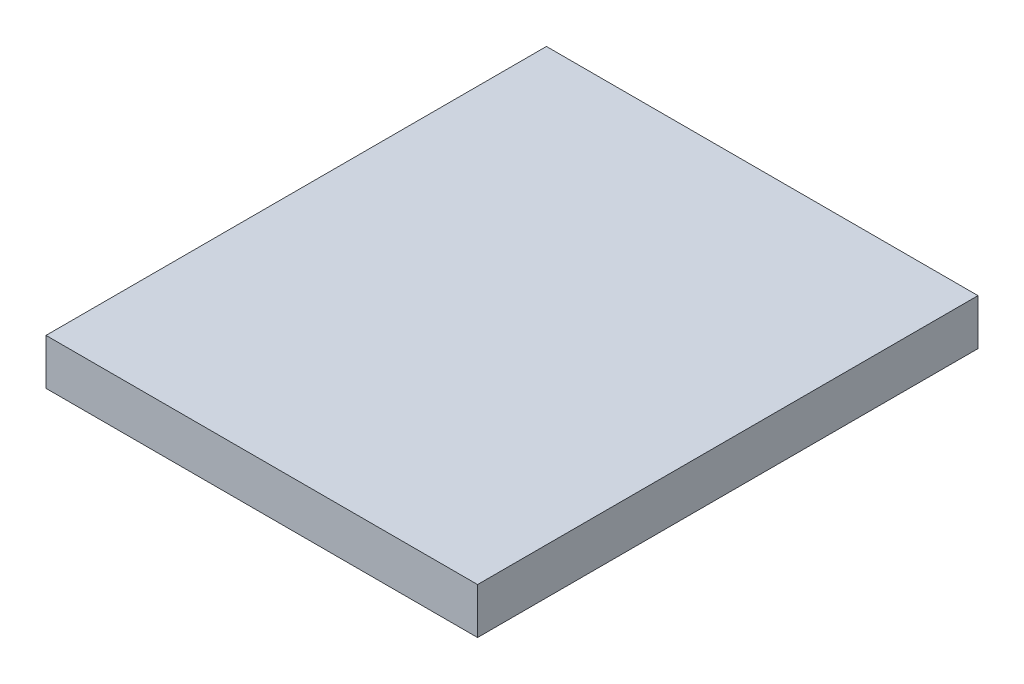
ISO-10303-21;
HEADER;
FILE_DESCRIPTION(('STEP AP214'),'2;1');
FILE_NAME('part.step','',(''),(''),'','','');
FILE_SCHEMA(('AUTOMOTIVE_DESIGN { 1 0 10303 214 1 1 1 1 }'));
ENDSEC;
DATA;
#1=APPLICATION_CONTEXT('core data for automotive mechanical design processes');
#2=APPLICATION_PROTOCOL_DEFINITION('international standard','automotive_design',2000,#1);
#3=PRODUCT_CONTEXT('',#1,'mechanical');
#4=PRODUCT('Part','Part','',(#3));
#5=PRODUCT_RELATED_PRODUCT_CATEGORY('part','',(#4));
#6=PRODUCT_DEFINITION_FORMATION('','',#4);
#7=PRODUCT_DEFINITION_CONTEXT('part definition',#1,'design');
#8=PRODUCT_DEFINITION('design','',#6,#7);
#9=PRODUCT_DEFINITION_SHAPE('','',#8);
#10=(LENGTH_UNIT() NAMED_UNIT(*) SI_UNIT(.MILLI.,.METRE.));
#11=(NAMED_UNIT(*) PLANE_ANGLE_UNIT() SI_UNIT($,.RADIAN.));
#12=(NAMED_UNIT(*) SI_UNIT($,.STERADIAN.) SOLID_ANGLE_UNIT());
#13=UNCERTAINTY_MEASURE_WITH_UNIT(LENGTH_MEASURE(1.E-05),#10,'distance_accuracy_value','');
#14=(GEOMETRIC_REPRESENTATION_CONTEXT(3) GLOBAL_UNCERTAINTY_ASSIGNED_CONTEXT((#13)) GLOBAL_UNIT_ASSIGNED_CONTEXT((#10,
#11,#12)) REPRESENTATION_CONTEXT('',''));
#15=CARTESIAN_POINT('',(0.,0.,0.));
#16=DIRECTION('',(0.,0.,1.));
#17=DIRECTION('',(1.,0.,0.));
#18=AXIS2_PLACEMENT_3D('',#15,#16,#17);
#19=CARTESIAN_POINT('',(0.,0.,0.));
#20=DIRECTION('',(0.,-1.,0.));
#21=DIRECTION('',(0.,0.,-1.));
#22=AXIS2_PLACEMENT_3D('',#19,#20,#21);
#23=PLANE('',#22);
#24=DIRECTION('',(0.,0.,-1.));
#25=VECTOR('',#24,1.);
#26=CARTESIAN_POINT('',(47.,0.,54.5));
#27=LINE('',#26,#25);
#28=CARTESIAN_POINT('',(47.,0.,54.5));
#29=VERTEX_POINT('',#28);
#30=CARTESIAN_POINT('',(47.,0.,-54.5));
#31=VERTEX_POINT('',#30);
#32=EDGE_CURVE('E130',#29,#31,#27,.T.);
#33=ORIENTED_EDGE('',*,*,#32,.F.);
#34=DIRECTION('',(1.,0.,0.));
#35=VECTOR('',#34,1.);
#36=CARTESIAN_POINT('',(-47.,0.,54.5));
#37=LINE('',#36,#35);
#38=CARTESIAN_POINT('',(-47.,0.,54.5));
#39=VERTEX_POINT('',#38);
#40=EDGE_CURVE('E78',#39,#29,#37,.T.);
#41=ORIENTED_EDGE('',*,*,#40,.F.);
#42=DIRECTION('',(0.,0.,1.));
#43=VECTOR('',#42,1.);
#44=CARTESIAN_POINT('',(-47.,0.,54.5));
#45=LINE('',#44,#43);
#46=CARTESIAN_POINT('',(-47.,0.,-54.5));
#47=VERTEX_POINT('',#46);
#48=EDGE_CURVE('E158',#47,#39,#45,.T.);
#49=ORIENTED_EDGE('',*,*,#48,.F.);
#50=DIRECTION('',(-1.,0.,0.));
#51=VECTOR('',#50,1.);
#52=CARTESIAN_POINT('',(-47.,0.,-54.5));
#53=LINE('',#52,#51);
#54=EDGE_CURVE('E134',#31,#47,#53,.T.);
#55=ORIENTED_EDGE('',*,*,#54,.F.);
#56=EDGE_LOOP('',(#33,#41,#49,#55));
#57=FACE_BOUND('',#56,.T.);
#58=DIRECTION('',(1.,0.,0.));
#59=VECTOR('',#58,1.);
#60=CARTESIAN_POINT('',(0.,0.,52.5));
#61=LINE('',#60,#59);
#62=CARTESIAN_POINT('',(-45.,0.,52.5));
#63=VERTEX_POINT('',#62);
#64=CARTESIAN_POINT('',(45.,0.,52.5));
#65=VERTEX_POINT('',#64);
#66=EDGE_CURVE('E125',#63,#65,#61,.T.);
#67=ORIENTED_EDGE('',*,*,#66,.T.);
#68=DIRECTION('',(0.,0.,-1.));
#69=VECTOR('',#68,1.);
#70=CARTESIAN_POINT('',(45.,0.,0.));
#71=LINE('',#70,#69);
#72=CARTESIAN_POINT('',(45.,0.,-52.5));
#73=VERTEX_POINT('',#72);
#74=EDGE_CURVE('E144',#65,#73,#71,.T.);
#75=ORIENTED_EDGE('',*,*,#74,.T.);
#76=DIRECTION('',(-1.,0.,0.));
#77=VECTOR('',#76,1.);
#78=CARTESIAN_POINT('',(0.,0.,-52.5));
#79=LINE('',#78,#77);
#80=CARTESIAN_POINT('',(-45.,0.,-52.5));
#81=VERTEX_POINT('',#80);
#82=EDGE_CURVE('E129',#73,#81,#79,.T.);
#83=ORIENTED_EDGE('',*,*,#82,.T.);
#84=DIRECTION('',(0.,0.,1.));
#85=VECTOR('',#84,1.);
#86=CARTESIAN_POINT('',(-45.,0.,0.));
#87=LINE('',#86,#85);
#88=EDGE_CURVE('E48',#81,#63,#87,.T.);
#89=ORIENTED_EDGE('',*,*,#88,.T.);
#90=EDGE_LOOP('',(#67,#75,#83,#89));
#91=FACE_BOUND('',#90,.T.);
#92=ADVANCED_FACE('F33',(#57,#91),#23,.T.);
#93=CARTESIAN_POINT('',(47.,10.,54.5));
#94=DIRECTION('',(-1.,0.,0.));
#95=DIRECTION('',(0.,0.,1.));
#96=AXIS2_PLACEMENT_3D('',#93,#94,#95);
#97=PLANE('',#96);
#98=ORIENTED_EDGE('',*,*,#32,.T.);
#99=DIRECTION('',(0.,-1.,0.));
#100=VECTOR('',#99,1.);
#101=CARTESIAN_POINT('',(47.,10.,-54.5));
#102=LINE('',#101,#100);
#103=CARTESIAN_POINT('',(47.,10.,-54.5));
#104=VERTEX_POINT('',#103);
#105=EDGE_CURVE('E11',#104,#31,#102,.T.);
#106=ORIENTED_EDGE('',*,*,#105,.F.);
#107=DIRECTION('',(0.,0.,-1.));
#108=VECTOR('',#107,1.);
#109=CARTESIAN_POINT('',(47.,10.,54.5));
#110=LINE('',#109,#108);
#111=CARTESIAN_POINT('',(47.,10.,54.5));
#112=VERTEX_POINT('',#111);
#113=EDGE_CURVE('E150',#112,#104,#110,.T.);
#114=ORIENTED_EDGE('',*,*,#113,.F.);
#115=DIRECTION('',(0.,-1.,0.));
#116=VECTOR('',#115,1.);
#117=CARTESIAN_POINT('',(47.,10.,54.5));
#118=LINE('',#117,#116);
#119=EDGE_CURVE('E155',#112,#29,#118,.T.);
#120=ORIENTED_EDGE('',*,*,#119,.T.);
#121=EDGE_LOOP('',(#98,#106,#114,#120));
#122=FACE_BOUND('',#121,.T.);
#123=ADVANCED_FACE('F35',(#122),#97,.F.);
#124=CARTESIAN_POINT('',(-47.,10.,-54.5));
#125=DIRECTION('',(0.,0.,1.));
#126=DIRECTION('',(1.,0.,0.));
#127=AXIS2_PLACEMENT_3D('',#124,#125,#126);
#128=PLANE('',#127);
#129=ORIENTED_EDGE('',*,*,#54,.T.);
#130=DIRECTION('',(0.,-1.,0.));
#131=VECTOR('',#130,1.);
#132=CARTESIAN_POINT('',(-47.,10.,-54.5));
#133=LINE('',#132,#131);
#134=CARTESIAN_POINT('',(-47.,10.,-54.5));
#135=VERTEX_POINT('',#134);
#136=EDGE_CURVE('E41',#135,#47,#133,.T.);
#137=ORIENTED_EDGE('',*,*,#136,.F.);
#138=DIRECTION('',(-1.,0.,0.));
#139=VECTOR('',#138,1.);
#140=CARTESIAN_POINT('',(-47.,10.,-54.5));
#141=LINE('',#140,#139);
#142=EDGE_CURVE('E85',#104,#135,#141,.T.);
#143=ORIENTED_EDGE('',*,*,#142,.F.);
#144=ORIENTED_EDGE('',*,*,#105,.T.);
#145=EDGE_LOOP('',(#129,#137,#143,#144));
#146=FACE_BOUND('',#145,.T.);
#147=ADVANCED_FACE('F184',(#146),#128,.F.);
#148=CARTESIAN_POINT('',(-47.,10.,54.5));
#149=DIRECTION('',(1.,0.,0.));
#150=DIRECTION('',(0.,0.,-1.));
#151=AXIS2_PLACEMENT_3D('',#148,#149,#150);
#152=PLANE('',#151);
#153=ORIENTED_EDGE('',*,*,#48,.T.);
#154=DIRECTION('',(0.,-1.,0.));
#155=VECTOR('',#154,1.);
#156=CARTESIAN_POINT('',(-47.,10.,54.5));
#157=LINE('',#156,#155);
#158=CARTESIAN_POINT('',(-47.,10.,54.5));
#159=VERTEX_POINT('',#158);
#160=EDGE_CURVE('E162',#159,#39,#157,.T.);
#161=ORIENTED_EDGE('',*,*,#160,.F.);
#162=DIRECTION('',(0.,0.,1.));
#163=VECTOR('',#162,1.);
#164=CARTESIAN_POINT('',(-47.,10.,54.5));
#165=LINE('',#164,#163);
#166=EDGE_CURVE('E153',#135,#159,#165,.T.);
#167=ORIENTED_EDGE('',*,*,#166,.F.);
#168=ORIENTED_EDGE('',*,*,#136,.T.);
#169=EDGE_LOOP('',(#153,#161,#167,#168));
#170=FACE_BOUND('',#169,.T.);
#171=ADVANCED_FACE('F167',(#170),#152,.F.);
#172=CARTESIAN_POINT('',(-47.,10.,54.5));
#173=DIRECTION('',(0.,0.,-1.));
#174=DIRECTION('',(-1.,0.,0.));
#175=AXIS2_PLACEMENT_3D('',#172,#173,#174);
#176=PLANE('',#175);
#177=ORIENTED_EDGE('',*,*,#40,.T.);
#178=ORIENTED_EDGE('',*,*,#119,.F.);
#179=DIRECTION('',(1.,0.,0.));
#180=VECTOR('',#179,1.);
#181=CARTESIAN_POINT('',(-47.,10.,54.5));
#182=LINE('',#181,#180);
#183=EDGE_CURVE('E57',#159,#112,#182,.T.);
#184=ORIENTED_EDGE('',*,*,#183,.F.);
#185=ORIENTED_EDGE('',*,*,#160,.T.);
#186=EDGE_LOOP('',(#177,#178,#184,#185));
#187=FACE_BOUND('',#186,.T.);
#188=ADVANCED_FACE('F175',(#187),#176,.F.);
#189=CARTESIAN_POINT('',(0.,10.,0.));
#190=DIRECTION('',(0.,-1.,0.));
#191=DIRECTION('',(0.,0.,-1.));
#192=AXIS2_PLACEMENT_3D('',#189,#190,#191);
#193=PLANE('',#192);
#194=ORIENTED_EDGE('',*,*,#113,.T.);
#195=ORIENTED_EDGE('',*,*,#142,.T.);
#196=ORIENTED_EDGE('',*,*,#166,.T.);
#197=ORIENTED_EDGE('',*,*,#183,.T.);
#198=EDGE_LOOP('',(#194,#195,#196,#197));
#199=FACE_BOUND('',#198,.T.);
#200=ADVANCED_FACE('F177',(#199),#193,.F.);
#201=CARTESIAN_POINT('',(45.,10.,54.5));
#202=DIRECTION('',(-1.,0.,0.));
#203=DIRECTION('',(0.,0.,1.));
#204=AXIS2_PLACEMENT_3D('',#201,#202,#203);
#205=PLANE('',#204);
#206=ORIENTED_EDGE('',*,*,#74,.F.);
#207=DIRECTION('',(0.,-1.,0.));
#208=VECTOR('',#207,1.);
#209=CARTESIAN_POINT('',(45.,10.,52.5));
#210=LINE('',#209,#208);
#211=CARTESIAN_POINT('',(45.,8.,52.5));
#212=VERTEX_POINT('',#211);
#213=EDGE_CURVE('E124',#212,#65,#210,.T.);
#214=ORIENTED_EDGE('',*,*,#213,.F.);
#215=DIRECTION('',(0.,0.,-1.));
#216=VECTOR('',#215,1.);
#217=CARTESIAN_POINT('',(45.,8.,0.));
#218=LINE('',#217,#216);
#219=CARTESIAN_POINT('',(45.,8.,-52.5));
#220=VERTEX_POINT('',#219);
#221=EDGE_CURVE('E112',#212,#220,#218,.T.);
#222=ORIENTED_EDGE('',*,*,#221,.T.);
#223=DIRECTION('',(0.,-1.,0.));
#224=VECTOR('',#223,1.);
#225=CARTESIAN_POINT('',(45.,10.,-52.5));
#226=LINE('',#225,#224);
#227=EDGE_CURVE('E122',#220,#73,#226,.T.);
#228=ORIENTED_EDGE('',*,*,#227,.T.);
#229=EDGE_LOOP('',(#206,#214,#222,#228));
#230=FACE_BOUND('',#229,.T.);
#231=ADVANCED_FACE('F121',(#230),#205,.T.);
#232=CARTESIAN_POINT('',(-47.,10.,-52.5));
#233=DIRECTION('',(0.,0.,1.));
#234=DIRECTION('',(1.,0.,0.));
#235=AXIS2_PLACEMENT_3D('',#232,#233,#234);
#236=PLANE('',#235);
#237=ORIENTED_EDGE('',*,*,#82,.F.);
#238=ORIENTED_EDGE('',*,*,#227,.F.);
#239=DIRECTION('',(-1.,0.,0.));
#240=VECTOR('',#239,1.);
#241=CARTESIAN_POINT('',(0.,8.,-52.5));
#242=LINE('',#241,#240);
#243=CARTESIAN_POINT('',(-45.,8.,-52.5));
#244=VERTEX_POINT('',#243);
#245=EDGE_CURVE('E108',#220,#244,#242,.T.);
#246=ORIENTED_EDGE('',*,*,#245,.T.);
#247=DIRECTION('',(0.,-1.,0.));
#248=VECTOR('',#247,1.);
#249=CARTESIAN_POINT('',(-45.,10.,-52.5));
#250=LINE('',#249,#248);
#251=EDGE_CURVE('E131',#244,#81,#250,.T.);
#252=ORIENTED_EDGE('',*,*,#251,.T.);
#253=EDGE_LOOP('',(#237,#238,#246,#252));
#254=FACE_BOUND('',#253,.T.);
#255=ADVANCED_FACE('F127',(#254),#236,.T.);
#256=CARTESIAN_POINT('',(-45.,10.,54.5));
#257=DIRECTION('',(1.,0.,0.));
#258=DIRECTION('',(0.,0.,-1.));
#259=AXIS2_PLACEMENT_3D('',#256,#257,#258);
#260=PLANE('',#259);
#261=ORIENTED_EDGE('',*,*,#88,.F.);
#262=ORIENTED_EDGE('',*,*,#251,.F.);
#263=DIRECTION('',(0.,0.,1.));
#264=VECTOR('',#263,1.);
#265=CARTESIAN_POINT('',(-45.,8.,0.));
#266=LINE('',#265,#264);
#267=CARTESIAN_POINT('',(-45.,8.,52.5));
#268=VERTEX_POINT('',#267);
#269=EDGE_CURVE('E113',#244,#268,#266,.T.);
#270=ORIENTED_EDGE('',*,*,#269,.T.);
#271=DIRECTION('',(0.,-1.,0.));
#272=VECTOR('',#271,1.);
#273=CARTESIAN_POINT('',(-45.,10.,52.5));
#274=LINE('',#273,#272);
#275=EDGE_CURVE('E136',#268,#63,#274,.T.);
#276=ORIENTED_EDGE('',*,*,#275,.T.);
#277=EDGE_LOOP('',(#261,#262,#270,#276));
#278=FACE_BOUND('',#277,.T.);
#279=ADVANCED_FACE('F197',(#278),#260,.T.);
#280=CARTESIAN_POINT('',(-47.,10.,52.5));
#281=DIRECTION('',(0.,0.,-1.));
#282=DIRECTION('',(-1.,0.,0.));
#283=AXIS2_PLACEMENT_3D('',#280,#281,#282);
#284=PLANE('',#283);
#285=ORIENTED_EDGE('',*,*,#66,.F.);
#286=ORIENTED_EDGE('',*,*,#275,.F.);
#287=DIRECTION('',(1.,0.,0.));
#288=VECTOR('',#287,1.);
#289=CARTESIAN_POINT('',(0.,8.,52.5));
#290=LINE('',#289,#288);
#291=EDGE_CURVE('E139',#268,#212,#290,.T.);
#292=ORIENTED_EDGE('',*,*,#291,.T.);
#293=ORIENTED_EDGE('',*,*,#213,.T.);
#294=EDGE_LOOP('',(#285,#286,#292,#293));
#295=FACE_BOUND('',#294,.T.);
#296=ADVANCED_FACE('F194',(#295),#284,.T.);
#297=CARTESIAN_POINT('',(0.,8.,0.));
#298=DIRECTION('',(0.,-1.,0.));
#299=DIRECTION('',(0.,0.,-1.));
#300=AXIS2_PLACEMENT_3D('',#297,#298,#299);
#301=PLANE('',#300);
#302=ORIENTED_EDGE('',*,*,#221,.F.);
#303=ORIENTED_EDGE('',*,*,#291,.F.);
#304=ORIENTED_EDGE('',*,*,#269,.F.);
#305=ORIENTED_EDGE('',*,*,#245,.F.);
#306=EDGE_LOOP('',(#302,#303,#304,#305));
#307=FACE_BOUND('',#306,.T.);
#308=ADVANCED_FACE('F110',(#307),#301,.T.);
#309=CLOSED_SHELL('',(#92,#123,#147,#171,#188,#200,#231,#255,#279,#296,#308));
#310=MANIFOLD_SOLID_BREP('B2',#309);
#311=ADVANCED_BREP_SHAPE_REPRESENTATION('',(#18,#310),#14);
#312=SHAPE_DEFINITION_REPRESENTATION(#9,#311);
ENDSEC;
END-ISO-10303-21;
